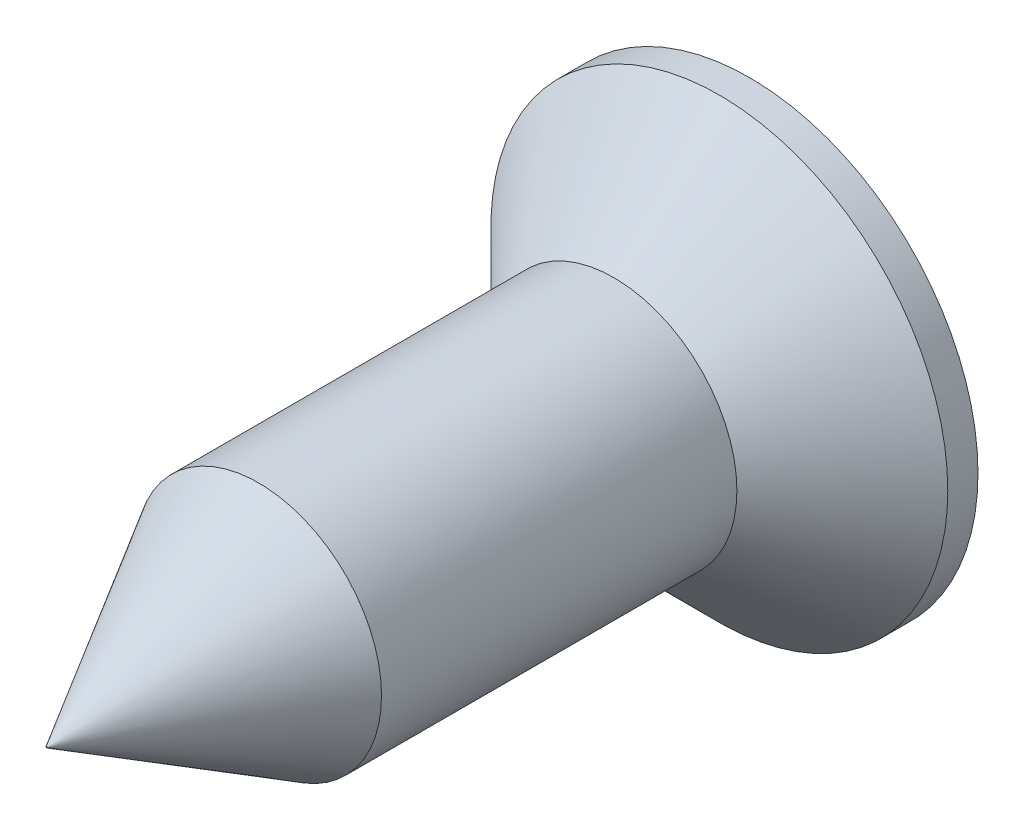
ISO-10303-21;
HEADER;
FILE_DESCRIPTION(('STEP AP214'),'2;1');
FILE_NAME('part.step','',(''),(''),'','','');
FILE_SCHEMA(('AUTOMOTIVE_DESIGN { 1 0 10303 214 1 1 1 1 }'));
ENDSEC;
DATA;
#1=APPLICATION_CONTEXT('core data for automotive mechanical design processes');
#2=APPLICATION_PROTOCOL_DEFINITION('international standard','automotive_design',2000,#1);
#3=PRODUCT_CONTEXT('',#1,'mechanical');
#4=PRODUCT('Part','Part','',(#3));
#5=PRODUCT_RELATED_PRODUCT_CATEGORY('part','',(#4));
#6=PRODUCT_DEFINITION_FORMATION('','',#4);
#7=PRODUCT_DEFINITION_CONTEXT('part definition',#1,'design');
#8=PRODUCT_DEFINITION('design','',#6,#7);
#9=PRODUCT_DEFINITION_SHAPE('','',#8);
#10=(LENGTH_UNIT() NAMED_UNIT(*) SI_UNIT(.MILLI.,.METRE.));
#11=(NAMED_UNIT(*) PLANE_ANGLE_UNIT() SI_UNIT($,.RADIAN.));
#12=(NAMED_UNIT(*) SI_UNIT($,.STERADIAN.) SOLID_ANGLE_UNIT());
#13=UNCERTAINTY_MEASURE_WITH_UNIT(LENGTH_MEASURE(1.E-05),#10,'distance_accuracy_value','');
#14=(GEOMETRIC_REPRESENTATION_CONTEXT(3) GLOBAL_UNCERTAINTY_ASSIGNED_CONTEXT((#13)) GLOBAL_UNIT_ASSIGNED_CONTEXT((#10,
#11,#12)) REPRESENTATION_CONTEXT('',''));
#15=CARTESIAN_POINT('',(0.,0.,0.));
#16=DIRECTION('',(0.,0.,1.));
#17=DIRECTION('',(1.,0.,0.));
#18=AXIS2_PLACEMENT_3D('',#15,#16,#17);
#19=CARTESIAN_POINT('',(3.25,0.,0.));
#20=DIRECTION('',(0.,0.,-1.));
#21=DIRECTION('',(-1.,0.,0.));
#22=AXIS2_PLACEMENT_3D('',#19,#20,#21);
#23=PLANE('',#22);
#24=DIRECTION('',(-1.,0.,0.));
#25=VECTOR('',#24,1.);
#26=CARTESIAN_POINT('',(3.25,2.58289897474369,0.));
#27=LINE('',#26,#25);
#28=CARTESIAN_POINT('',(-0.35,2.58289897474369,0.));
#29=VERTEX_POINT('',#28);
#30=CARTESIAN_POINT('',(0.349999999999998,2.58289897474369,0.));
#31=VERTEX_POINT('',#30);
#32=EDGE_CURVE('E53',#29,#31,#27,.F.);
#33=ORIENTED_EDGE('',*,*,#32,.F.);
#34=DIRECTION('',(0.,1.,0.));
#35=VECTOR('',#34,1.);
#36=CARTESIAN_POINT('',(-0.35,0.845898974743686,0.));
#37=LINE('',#36,#35);
#38=CARTESIAN_POINT('',(-0.35,0.583333333333333,0.));
#39=VERTEX_POINT('',#38);
#40=EDGE_CURVE('E148',#39,#29,#37,.T.);
#41=ORIENTED_EDGE('',*,*,#40,.F.);
#42=CARTESIAN_POINT('',(-0.583333333333333,0.583333333333333,0.));
#43=DIRECTION('',(0.,0.,1.));
#44=DIRECTION('',(1.,0.,0.));
#45=AXIS2_PLACEMENT_3D('',#42,#43,#44);
#46=CIRCLE('',#45,0.233333333333333);
#47=CARTESIAN_POINT('',(-0.583333333333333,0.35,0.));
#48=VERTEX_POINT('',#47);
#49=EDGE_CURVE('E145',#48,#39,#46,.T.);
#50=ORIENTED_EDGE('',*,*,#49,.F.);
#51=DIRECTION('',(1.,0.,0.));
#52=VECTOR('',#51,1.);
#53=CARTESIAN_POINT('',(-0.583333333333333,0.35,0.));
#54=LINE('',#53,#52);
#55=CARTESIAN_POINT('',(-2.58289897474369,0.35,0.));
#56=VERTEX_POINT('',#55);
#57=EDGE_CURVE('E142',#56,#48,#54,.T.);
#58=ORIENTED_EDGE('',*,*,#57,.F.);
#59=DIRECTION('',(0.,-1.,0.));
#60=VECTOR('',#59,1.);
#61=CARTESIAN_POINT('',(-2.58289897474369,0.,0.));
#62=LINE('',#61,#60);
#63=CARTESIAN_POINT('',(-2.58289897474369,-0.35,0.));
#64=VERTEX_POINT('',#63);
#65=EDGE_CURVE('E141',#64,#56,#62,.F.);
#66=ORIENTED_EDGE('',*,*,#65,.F.);
#67=DIRECTION('',(-1.,0.,0.));
#68=VECTOR('',#67,1.);
#69=CARTESIAN_POINT('',(-0.845898974743686,-0.35,0.));
#70=LINE('',#69,#68);
#71=CARTESIAN_POINT('',(-0.583333333333333,-0.35,0.));
#72=VERTEX_POINT('',#71);
#73=EDGE_CURVE('E135',#72,#64,#70,.T.);
#74=ORIENTED_EDGE('',*,*,#73,.F.);
#75=CARTESIAN_POINT('',(-0.583333333333333,-0.583333333333333,0.));
#76=DIRECTION('',(0.,0.,1.));
#77=DIRECTION('',(1.,0.,0.));
#78=AXIS2_PLACEMENT_3D('',#75,#76,#77);
#79=CIRCLE('',#78,0.233333333333333);
#80=CARTESIAN_POINT('',(-0.35,-0.583333333333333,0.));
#81=VERTEX_POINT('',#80);
#82=EDGE_CURVE('E133',#81,#72,#79,.T.);
#83=ORIENTED_EDGE('',*,*,#82,.F.);
#84=DIRECTION('',(0.,1.,0.));
#85=VECTOR('',#84,1.);
#86=CARTESIAN_POINT('',(-0.35,-0.583333333333333,0.));
#87=LINE('',#86,#85);
#88=CARTESIAN_POINT('',(-0.35,-2.58289897474369,0.));
#89=VERTEX_POINT('',#88);
#90=EDGE_CURVE('E111',#89,#81,#87,.T.);
#91=ORIENTED_EDGE('',*,*,#90,.F.);
#92=DIRECTION('',(1.,0.,0.));
#93=VECTOR('',#92,1.);
#94=CARTESIAN_POINT('',(3.25,-2.58289897474369,0.));
#95=LINE('',#94,#93);
#96=CARTESIAN_POINT('',(0.35,-2.58289897474369,0.));
#97=VERTEX_POINT('',#96);
#98=EDGE_CURVE('E123',#97,#89,#95,.F.);
#99=ORIENTED_EDGE('',*,*,#98,.F.);
#100=DIRECTION('',(0.,-1.,0.));
#101=VECTOR('',#100,1.);
#102=CARTESIAN_POINT('',(0.35,-0.845898974743686,0.));
#103=LINE('',#102,#101);
#104=CARTESIAN_POINT('',(0.35,-0.583333333333333,0.));
#105=VERTEX_POINT('',#104);
#106=EDGE_CURVE('E129',#105,#97,#103,.T.);
#107=ORIENTED_EDGE('',*,*,#106,.F.);
#108=CARTESIAN_POINT('',(0.583333333333333,-0.583333333333333,0.));
#109=DIRECTION('',(0.,0.,1.));
#110=DIRECTION('',(1.,0.,0.));
#111=AXIS2_PLACEMENT_3D('',#108,#109,#110);
#112=CIRCLE('',#111,0.233333333333333);
#113=CARTESIAN_POINT('',(0.583333333333333,-0.35,0.));
#114=VERTEX_POINT('',#113);
#115=EDGE_CURVE('E240',#114,#105,#112,.T.);
#116=ORIENTED_EDGE('',*,*,#115,.F.);
#117=DIRECTION('',(-1.,0.,0.));
#118=VECTOR('',#117,1.);
#119=CARTESIAN_POINT('',(0.583333333333333,-0.35,0.));
#120=LINE('',#119,#118);
#121=CARTESIAN_POINT('',(2.58289897474369,-0.35,0.));
#122=VERTEX_POINT('',#121);
#123=EDGE_CURVE('E194',#122,#114,#120,.T.);
#124=ORIENTED_EDGE('',*,*,#123,.F.);
#125=DIRECTION('',(0.,1.,0.));
#126=VECTOR('',#125,1.);
#127=CARTESIAN_POINT('',(2.58289897474369,0.,0.));
#128=LINE('',#127,#126);
#129=CARTESIAN_POINT('',(2.58289897474369,0.35,0.));
#130=VERTEX_POINT('',#129);
#131=EDGE_CURVE('E191',#130,#122,#128,.F.);
#132=ORIENTED_EDGE('',*,*,#131,.F.);
#133=DIRECTION('',(1.,0.,0.));
#134=VECTOR('',#133,1.);
#135=CARTESIAN_POINT('',(0.845898974743686,0.35,0.));
#136=LINE('',#135,#134);
#137=CARTESIAN_POINT('',(0.583333333333333,0.35,0.));
#138=VERTEX_POINT('',#137);
#139=EDGE_CURVE('E195',#138,#130,#136,.T.);
#140=ORIENTED_EDGE('',*,*,#139,.F.);
#141=CARTESIAN_POINT('',(0.583333333333333,0.583333333333333,0.));
#142=DIRECTION('',(0.,0.,1.));
#143=DIRECTION('',(1.,0.,0.));
#144=AXIS2_PLACEMENT_3D('',#141,#142,#143);
#145=CIRCLE('',#144,0.233333333333333);
#146=CARTESIAN_POINT('',(0.35,0.583333333333333,0.));
#147=VERTEX_POINT('',#146);
#148=EDGE_CURVE('E249',#147,#138,#145,.T.);
#149=ORIENTED_EDGE('',*,*,#148,.F.);
#150=DIRECTION('',(0.,-1.,0.));
#151=VECTOR('',#150,1.);
#152=CARTESIAN_POINT('',(0.35,0.583333333333333,0.));
#153=LINE('',#152,#151);
#154=EDGE_CURVE('E187',#31,#147,#153,.T.);
#155=ORIENTED_EDGE('',*,*,#154,.F.);
#156=EDGE_LOOP('',(#33,#41,#50,#58,#66,#74,#83,#91,#99,#107,#116,#124,#132,#140,#149,#155));
#157=FACE_BOUND('',#156,.T.);
#158=CARTESIAN_POINT('',(0.,0.,0.));
#159=DIRECTION('',(0.,0.,1.));
#160=DIRECTION('',(1.,0.,0.));
#161=AXIS2_PLACEMENT_3D('',#158,#159,#160);
#162=CIRCLE('',#161,3.25);
#163=CARTESIAN_POINT('',(3.25,0.,0.));
#164=VERTEX_POINT('',#163);
#165=EDGE_CURVE('E11',#164,#164,#162,.T.);
#166=ORIENTED_EDGE('',*,*,#165,.F.);
#167=EDGE_LOOP('',(#166));
#168=FACE_BOUND('',#167,.T.);
#169=ADVANCED_FACE('F34',(#157,#168),#23,.T.);
#170=CARTESIAN_POINT('',(0.,0.,0.));
#171=DIRECTION('',(0.,0.,1.));
#172=DIRECTION('',(1.,0.,0.));
#173=AXIS2_PLACEMENT_3D('',#170,#171,#172);
#174=CYLINDRICAL_SURFACE('',#173,3.25);
#175=ORIENTED_EDGE('',*,*,#165,.T.);
#176=EDGE_LOOP('',(#175));
#177=FACE_BOUND('',#176,.T.);
#178=CARTESIAN_POINT('',(0.,0.,0.430000000000016));
#179=DIRECTION('',(0.,0.,1.));
#180=DIRECTION('',(1.,0.,0.));
#181=AXIS2_PLACEMENT_3D('',#178,#179,#180);
#182=CIRCLE('',#181,3.25);
#183=CARTESIAN_POINT('',(3.25,0.,0.430000000000016));
#184=VERTEX_POINT('',#183);
#185=EDGE_CURVE('E44',#184,#184,#182,.T.);
#186=ORIENTED_EDGE('',*,*,#185,.F.);
#187=EDGE_LOOP('',(#186));
#188=FACE_BOUND('',#187,.T.);
#189=ADVANCED_FACE('F338',(#177,#188),#174,.T.);
#190=CARTESIAN_POINT('',(0.,0.,1.93));
#191=DIRECTION('',(0.,0.,-1.));
#192=DIRECTION('',(-1.,0.,0.));
#193=AXIS2_PLACEMENT_3D('',#190,#191,#192);
#194=CONICAL_SURFACE('',#193,1.75,0.785398163397453);
#195=ORIENTED_EDGE('',*,*,#185,.T.);
#196=EDGE_LOOP('',(#195));
#197=FACE_BOUND('',#196,.T.);
#198=CARTESIAN_POINT('',(0.,0.,1.93));
#199=DIRECTION('',(0.,0.,1.));
#200=DIRECTION('',(1.,0.,0.));
#201=AXIS2_PLACEMENT_3D('',#198,#199,#200);
#202=CIRCLE('',#201,1.75);
#203=CARTESIAN_POINT('',(1.75,0.,1.93));
#204=VERTEX_POINT('',#203);
#205=EDGE_CURVE('E180',#204,#204,#202,.T.);
#206=ORIENTED_EDGE('',*,*,#205,.F.);
#207=EDGE_LOOP('',(#206));
#208=FACE_BOUND('',#207,.T.);
#209=ADVANCED_FACE('F343',(#197,#208),#194,.T.);
#210=CARTESIAN_POINT('',(0.,0.,0.));
#211=DIRECTION('',(0.,0.,1.));
#212=DIRECTION('',(1.,0.,0.));
#213=AXIS2_PLACEMENT_3D('',#210,#211,#212);
#214=CYLINDRICAL_SURFACE('',#213,1.75);
#215=ORIENTED_EDGE('',*,*,#205,.T.);
#216=EDGE_LOOP('',(#215));
#217=FACE_BOUND('',#216,.T.);
#218=CARTESIAN_POINT('',(0.,0.,6.98623159483011));
#219=DIRECTION('',(0.,0.,1.));
#220=DIRECTION('',(1.,0.,0.));
#221=AXIS2_PLACEMENT_3D('',#218,#219,#220);
#222=CIRCLE('',#221,1.75);
#223=CARTESIAN_POINT('',(-1.75,0.,6.98623159483011));
#224=VERTEX_POINT('',#223);
#225=EDGE_CURVE('E177',#224,#224,#222,.T.);
#226=ORIENTED_EDGE('',*,*,#225,.F.);
#227=EDGE_LOOP('',(#226));
#228=FACE_BOUND('',#227,.T.);
#229=ADVANCED_FACE('F385',(#217,#228),#214,.T.);
#230=CARTESIAN_POINT('',(0.,0.,10.));
#231=DIRECTION('',(0.,0.,-1.));
#232=DIRECTION('',(-1.,0.,0.));
#233=AXIS2_PLACEMENT_3D('',#230,#231,#232);
#234=CONICAL_SURFACE('',#233,0.0100000000000012,0.523598775598293);
#235=CARTESIAN_POINT('',(0.,0.,10.));
#236=DIRECTION('',(0.,0.,1.));
#237=DIRECTION('',(1.,0.,0.));
#238=AXIS2_PLACEMENT_3D('',#235,#236,#237);
#239=CIRCLE('',#238,0.0100000000000012);
#240=CARTESIAN_POINT('',(-0.0100000000000017,0.,10.));
#241=VERTEX_POINT('',#240);
#242=EDGE_CURVE('E174',#241,#241,#239,.T.);
#243=CARTESIAN_POINT('',(-1.75,0.,6.98623159483011));
#244=CARTESIAN_POINT('',(-1.731875,0.,7.0176250157173));
#245=CARTESIAN_POINT('',(-1.71375,0.,7.04901843660449));
#246=CARTESIAN_POINT('',(-1.6775,0.,7.11180527837886));
#247=CARTESIAN_POINT('',(-1.659375,0.,7.14319869926604));
#248=CARTESIAN_POINT('',(-1.623125,0.,7.20598554104042));
#249=CARTESIAN_POINT('',(-1.605,0.,7.2373789619276));
#250=CARTESIAN_POINT('',(-1.56875,0.,7.30016580370198));
#251=CARTESIAN_POINT('',(-1.550625,0.,7.33155922458916));
#252=CARTESIAN_POINT('',(-1.514375,0.,7.39434606636353));
#253=CARTESIAN_POINT('',(-1.49625,0.,7.42573948725072));
#254=CARTESIAN_POINT('',(-1.46,0.,7.48852632902509));
#255=CARTESIAN_POINT('',(-1.441875,0.,7.51991974991228));
#256=CARTESIAN_POINT('',(-1.405625,0.,7.58270659168665));
#257=CARTESIAN_POINT('',(-1.3875,0.,7.61410001257384));
#258=CARTESIAN_POINT('',(-1.35125,0.,7.67688685434821));
#259=CARTESIAN_POINT('',(-1.333125,0.,7.7082802752354));
#260=CARTESIAN_POINT('',(-1.296875,0.,7.77106711700977));
#261=CARTESIAN_POINT('',(-1.27875,0.,7.80246053789696));
#262=CARTESIAN_POINT('',(-1.2425,0.,7.86524737967133));
#263=CARTESIAN_POINT('',(-1.224375,0.,7.89664080055852));
#264=CARTESIAN_POINT('',(-1.188125,0.,7.95942764233289));
#265=CARTESIAN_POINT('',(-1.17,0.,7.99082106322008));
#266=CARTESIAN_POINT('',(-1.13375,0.,8.05360790499445));
#267=CARTESIAN_POINT('',(-1.115625,0.,8.08500132588163));
#268=CARTESIAN_POINT('',(-1.079375,0.,8.147788167656));
#269=CARTESIAN_POINT('',(-1.06125,0.,8.17918158854319));
#270=CARTESIAN_POINT('',(-1.025,0.,8.24196843031756));
#271=CARTESIAN_POINT('',(-1.006875,0.,8.27336185120475));
#272=CARTESIAN_POINT('',(-0.970625000000001,0.,8.33614869297912));
#273=CARTESIAN_POINT('',(-0.952500000000001,0.,8.36754211386631));
#274=CARTESIAN_POINT('',(-0.916250000000001,0.,8.43032895564068));
#275=CARTESIAN_POINT('',(-0.898125000000001,0.,8.46172237652787));
#276=CARTESIAN_POINT('',(-0.861875000000001,0.,8.52450921830224));
#277=CARTESIAN_POINT('',(-0.843750000000001,0.,8.55590263918943));
#278=CARTESIAN_POINT('',(-0.807500000000001,0.,8.6186894809638));
#279=CARTESIAN_POINT('',(-0.789375000000001,0.,8.65008290185099));
#280=CARTESIAN_POINT('',(-0.753125000000001,0.,8.71286974362536));
#281=CARTESIAN_POINT('',(-0.735000000000001,0.,8.74426316451255));
#282=CARTESIAN_POINT('',(-0.698750000000001,0.,8.80705000628692));
#283=CARTESIAN_POINT('',(-0.680625000000001,0.,8.8384434271741));
#284=CARTESIAN_POINT('',(-0.644375000000001,0.,8.90123026894848));
#285=CARTESIAN_POINT('',(-0.626250000000001,0.,8.93262368983567));
#286=CARTESIAN_POINT('',(-0.590000000000001,0.,8.99541053161004));
#287=CARTESIAN_POINT('',(-0.571875000000001,0.,9.02680395249722));
#288=CARTESIAN_POINT('',(-0.535625000000001,0.,9.0895907942716));
#289=CARTESIAN_POINT('',(-0.517500000000001,0.,9.12098421515878));
#290=CARTESIAN_POINT('',(-0.481250000000001,0.,9.18377105693316));
#291=CARTESIAN_POINT('',(-0.463125000000001,0.,9.21516447782034));
#292=CARTESIAN_POINT('',(-0.426875000000002,0.,9.27795131959471));
#293=CARTESIAN_POINT('',(-0.408750000000002,0.,9.3093447404819));
#294=CARTESIAN_POINT('',(-0.372500000000001,0.,9.37213158225627));
#295=CARTESIAN_POINT('',(-0.354375000000001,0.,9.40352500314346));
#296=CARTESIAN_POINT('',(-0.318125000000002,0.,9.46631184491783));
#297=CARTESIAN_POINT('',(-0.300000000000002,0.,9.49770526580502));
#298=CARTESIAN_POINT('',(-0.263750000000002,0.,9.56049210757939));
#299=CARTESIAN_POINT('',(-0.245625000000001,0.,9.59188552846658));
#300=CARTESIAN_POINT('',(-0.209375000000002,0.,9.65467237024095));
#301=CARTESIAN_POINT('',(-0.191250000000002,0.,9.68606579112814));
#302=CARTESIAN_POINT('',(-0.155000000000002,0.,9.74885263290251));
#303=CARTESIAN_POINT('',(-0.136875000000002,0.,9.7802460537897));
#304=CARTESIAN_POINT('',(-0.100625000000001,0.,9.84303289556407));
#305=CARTESIAN_POINT('',(-0.0825000000000015,0.,9.87442631645125));
#306=CARTESIAN_POINT('',(-0.0462500000000017,0.,9.93721315822563));
#307=CARTESIAN_POINT('',(-0.0281250000000018,0.,9.96860657911281));
#308=CARTESIAN_POINT('',(-0.0100000000000017,0.,10.));
#309=B_SPLINE_CURVE_WITH_KNOTS('',3,(#243,#244,#245,#246,#247,#248,#249,#250,#251,#252,#253,
#254,#255,#256,#257,#258,#259,#260,#261,#262,#263,#264,#265,#266,#267,#268,#269,#270,#271,#272,
#273,#274,#275,#276,#277,#278,#279,#280,#281,#282,#283,#284,#285,#286,#287,#288,#289,#290,#291,
#292,#293,#294,#295,#296,#297,#298,#299,#300,#301,#302,#303,#304,#305,#306,#307,#308),
.UNSPECIFIED.,.F.,.F.,(4,2,2,2,2,2,2,2,2,2,2,2,2,2,2,2,2,2,2,2,2,2,2,2,2,2,2,2,2,2,2,2,4),(0.,
0.108750000000001,0.217500000000002,0.326250000000003,0.435000000000005,0.543750000000005,
0.652500000000007,0.761250000000008,0.870000000000009,0.978750000000009,1.08750000000001,
1.19625000000001,1.30500000000001,1.41375000000001,1.52250000000002,1.63125000000002,
1.74000000000002,1.84875000000002,1.95750000000002,2.06625000000002,2.17500000000002,
2.28375000000002,2.39250000000002,2.50125000000003,2.61000000000003,2.71875000000003,
2.82750000000003,2.93625000000003,3.04500000000003,3.15375000000003,3.26250000000003,
3.37125000000003,3.48000000000004),.UNSPECIFIED.);
#310=EDGE_CURVE('BSEAM381',#224,#241,#309,.T.);
#311=ORIENTED_EDGE('',*,*,#225,.T.);
#312=ORIENTED_EDGE('',*,*,#242,.F.);
#313=ORIENTED_EDGE('',*,*,#310,.T.);
#314=ORIENTED_EDGE('',*,*,#310,.F.);
#315=EDGE_LOOP('',(#311,#313,#312,#314));
#316=FACE_BOUND('',#315,.T.);
#317=ADVANCED_FACE('F381',(#316),#234,.T.);
#318=CARTESIAN_POINT('',(0.,0.,10.));
#319=DIRECTION('',(0.,0.,1.));
#320=DIRECTION('',(1.,0.,0.));
#321=AXIS2_PLACEMENT_3D('',#318,#319,#320);
#322=PLANE('',#321);
#323=ORIENTED_EDGE('',*,*,#242,.T.);
#324=EDGE_LOOP('',(#323));
#325=FACE_BOUND('',#324,.T.);
#326=ADVANCED_FACE('F378',(#325),#322,.T.);
#327=CARTESIAN_POINT('',(0.35,0.845898974743686,1.737));
#328=DIRECTION('',(0.,-0.707106781186546,-0.707106781186549));
#329=DIRECTION('',(0.,0.707106781186549,-0.707106781186546));
#330=AXIS2_PLACEMENT_3D('',#327,#328,#329);
#331=PLANE('',#330);
#332=ORIENTED_EDGE('',*,*,#32,.T.);
#333=DIRECTION('',(0.,-0.707106781186549,0.707106781186546));
#334=VECTOR('',#333,1.);
#335=CARTESIAN_POINT('',(0.35,0.845898974743686,1.737));
#336=LINE('',#335,#334);
#337=CARTESIAN_POINT('',(0.35,0.845898974743686,1.737));
#338=VERTEX_POINT('',#337);
#339=EDGE_CURVE('E173',#338,#31,#336,.F.);
#340=ORIENTED_EDGE('',*,*,#339,.F.);
#341=DIRECTION('',(1.,0.,0.));
#342=VECTOR('',#341,1.);
#343=CARTESIAN_POINT('',(0.35,0.845898974743686,1.737));
#344=LINE('',#343,#342);
#345=CARTESIAN_POINT('',(-0.35,0.845898974743686,1.737));
#346=VERTEX_POINT('',#345);
#347=EDGE_CURVE('E151',#346,#338,#344,.T.);
#348=ORIENTED_EDGE('',*,*,#347,.F.);
#349=DIRECTION('',(0.,-0.707106781186549,0.707106781186546));
#350=VECTOR('',#349,1.);
#351=CARTESIAN_POINT('',(-0.35,0.845898974743686,1.737));
#352=LINE('',#351,#350);
#353=EDGE_CURVE('E154',#346,#29,#352,.F.);
#354=ORIENTED_EDGE('',*,*,#353,.T.);
#355=EDGE_LOOP('',(#332,#340,#348,#354));
#356=FACE_BOUND('',#355,.T.);
#357=ADVANCED_FACE('F36',(#356),#331,.T.);
#358=CARTESIAN_POINT('',(-0.35,0.845898974743686,1.737));
#359=DIRECTION('',(-1.,0.,0.));
#360=DIRECTION('',(0.,0.,1.));
#361=AXIS2_PLACEMENT_3D('',#358,#359,#360);
#362=PLANE('',#361);
#363=ORIENTED_EDGE('',*,*,#40,.T.);
#364=ORIENTED_EDGE('',*,*,#353,.F.);
#365=DIRECTION('',(0.,1.,0.));
#366=VECTOR('',#365,1.);
#367=CARTESIAN_POINT('',(-0.35,0.845898974743686,1.737));
#368=LINE('',#367,#366);
#369=CARTESIAN_POINT('',(-0.35,0.583333333333333,1.737));
#370=VERTEX_POINT('',#369);
#371=EDGE_CURVE('E190',#370,#346,#368,.T.);
#372=ORIENTED_EDGE('',*,*,#371,.F.);
#373=DIRECTION('',(0.,0.,-1.));
#374=VECTOR('',#373,1.);
#375=CARTESIAN_POINT('',(-0.35,0.583333333333333,1.737));
#376=LINE('',#375,#374);
#377=EDGE_CURVE('E152',#370,#39,#376,.T.);
#378=ORIENTED_EDGE('',*,*,#377,.T.);
#379=EDGE_LOOP('',(#363,#364,#372,#378));
#380=FACE_BOUND('',#379,.T.);
#381=ADVANCED_FACE('F421',(#380),#362,.F.);
#382=CARTESIAN_POINT('',(-0.583333333333333,0.583333333333333,1.737));
#383=DIRECTION('',(0.,0.,-1.));
#384=DIRECTION('',(-1.,0.,0.));
#385=AXIS2_PLACEMENT_3D('',#382,#383,#384);
#386=CYLINDRICAL_SURFACE('',#385,0.233333333333333);
#387=ORIENTED_EDGE('',*,*,#49,.T.);
#388=ORIENTED_EDGE('',*,*,#377,.F.);
#389=CARTESIAN_POINT('',(-0.583333333333333,0.583333333333333,1.737));
#390=DIRECTION('',(0.,0.,1.));
#391=DIRECTION('',(1.,0.,0.));
#392=AXIS2_PLACEMENT_3D('',#389,#390,#391);
#393=CIRCLE('',#392,0.233333333333333);
#394=CARTESIAN_POINT('',(-0.583333333333333,0.35,1.737));
#395=VERTEX_POINT('',#394);
#396=EDGE_CURVE('E218',#395,#370,#393,.T.);
#397=ORIENTED_EDGE('',*,*,#396,.F.);
#398=DIRECTION('',(0.,0.,-1.));
#399=VECTOR('',#398,1.);
#400=CARTESIAN_POINT('',(-0.583333333333333,0.35,1.737));
#401=LINE('',#400,#399);
#402=EDGE_CURVE('E155',#395,#48,#401,.T.);
#403=ORIENTED_EDGE('',*,*,#402,.T.);
#404=EDGE_LOOP('',(#387,#388,#397,#403));
#405=FACE_BOUND('',#404,.T.);
#406=ADVANCED_FACE('F214',(#405),#386,.T.);
#407=CARTESIAN_POINT('',(-0.583333333333333,0.35,1.737));
#408=DIRECTION('',(0.,1.,0.));
#409=DIRECTION('',(0.,0.,1.));
#410=AXIS2_PLACEMENT_3D('',#407,#408,#409);
#411=PLANE('',#410);
#412=ORIENTED_EDGE('',*,*,#57,.T.);
#413=ORIENTED_EDGE('',*,*,#402,.F.);
#414=DIRECTION('',(1.,0.,0.));
#415=VECTOR('',#414,1.);
#416=CARTESIAN_POINT('',(-0.583333333333333,0.35,1.737));
#417=LINE('',#416,#415);
#418=CARTESIAN_POINT('',(-0.845898974743686,0.35,1.737));
#419=VERTEX_POINT('',#418);
#420=EDGE_CURVE('E207',#419,#395,#417,.T.);
#421=ORIENTED_EDGE('',*,*,#420,.F.);
#422=DIRECTION('',(0.707106781186549,0.,0.707106781186546));
#423=VECTOR('',#422,1.);
#424=CARTESIAN_POINT('',(-0.845898974743686,0.35,1.737));
#425=LINE('',#424,#423);
#426=EDGE_CURVE('E38',#419,#56,#425,.F.);
#427=ORIENTED_EDGE('',*,*,#426,.T.);
#428=EDGE_LOOP('',(#412,#413,#421,#427));
#429=FACE_BOUND('',#428,.T.);
#430=ADVANCED_FACE('F201',(#429),#411,.F.);
#431=CARTESIAN_POINT('',(-0.845898974743686,0.35,1.737));
#432=DIRECTION('',(0.707106781186546,0.,-0.707106781186549));
#433=DIRECTION('',(-0.707106781186549,0.,-0.707106781186546));
#434=AXIS2_PLACEMENT_3D('',#431,#432,#433);
#435=PLANE('',#434);
#436=ORIENTED_EDGE('',*,*,#65,.T.);
#437=ORIENTED_EDGE('',*,*,#426,.F.);
#438=DIRECTION('',(0.,1.,0.));
#439=VECTOR('',#438,1.);
#440=CARTESIAN_POINT('',(-0.845898974743686,0.35,1.737));
#441=LINE('',#440,#439);
#442=CARTESIAN_POINT('',(-0.845898974743686,-0.35,1.737));
#443=VERTEX_POINT('',#442);
#444=EDGE_CURVE('E258',#443,#419,#441,.T.);
#445=ORIENTED_EDGE('',*,*,#444,.F.);
#446=DIRECTION('',(0.707106781186549,0.,0.707106781186546));
#447=VECTOR('',#446,1.);
#448=CARTESIAN_POINT('',(-0.845898974743686,-0.35,1.737));
#449=LINE('',#448,#447);
#450=EDGE_CURVE('E76',#443,#64,#449,.F.);
#451=ORIENTED_EDGE('',*,*,#450,.T.);
#452=EDGE_LOOP('',(#436,#437,#445,#451));
#453=FACE_BOUND('',#452,.T.);
#454=ADVANCED_FACE('F210',(#453),#435,.T.);
#455=CARTESIAN_POINT('',(-0.845898974743686,-0.35,1.737));
#456=DIRECTION('',(0.,-1.,0.));
#457=DIRECTION('',(0.,0.,-1.));
#458=AXIS2_PLACEMENT_3D('',#455,#456,#457);
#459=PLANE('',#458);
#460=ORIENTED_EDGE('',*,*,#73,.T.);
#461=ORIENTED_EDGE('',*,*,#450,.F.);
#462=DIRECTION('',(-1.,0.,0.));
#463=VECTOR('',#462,1.);
#464=CARTESIAN_POINT('',(-0.845898974743686,-0.35,1.737));
#465=LINE('',#464,#463);
#466=CARTESIAN_POINT('',(-0.583333333333333,-0.35,1.737));
#467=VERTEX_POINT('',#466);
#468=EDGE_CURVE('E260',#467,#443,#465,.T.);
#469=ORIENTED_EDGE('',*,*,#468,.F.);
#470=DIRECTION('',(0.,0.,-1.));
#471=VECTOR('',#470,1.);
#472=CARTESIAN_POINT('',(-0.583333333333333,-0.35,1.737));
#473=LINE('',#472,#471);
#474=EDGE_CURVE('E86',#467,#72,#473,.T.);
#475=ORIENTED_EDGE('',*,*,#474,.T.);
#476=EDGE_LOOP('',(#460,#461,#469,#475));
#477=FACE_BOUND('',#476,.T.);
#478=ADVANCED_FACE('F325',(#477),#459,.F.);
#479=CARTESIAN_POINT('',(-0.583333333333333,-0.583333333333333,1.737));
#480=DIRECTION('',(0.,0.,-1.));
#481=DIRECTION('',(-1.,0.,0.));
#482=AXIS2_PLACEMENT_3D('',#479,#480,#481);
#483=CYLINDRICAL_SURFACE('',#482,0.233333333333333);
#484=ORIENTED_EDGE('',*,*,#82,.T.);
#485=ORIENTED_EDGE('',*,*,#474,.F.);
#486=CARTESIAN_POINT('',(-0.583333333333333,-0.583333333333333,1.737));
#487=DIRECTION('',(0.,0.,1.));
#488=DIRECTION('',(1.,0.,0.));
#489=AXIS2_PLACEMENT_3D('',#486,#487,#488);
#490=CIRCLE('',#489,0.233333333333333);
#491=CARTESIAN_POINT('',(-0.35,-0.583333333333333,1.737));
#492=VERTEX_POINT('',#491);
#493=EDGE_CURVE('E263',#492,#467,#490,.T.);
#494=ORIENTED_EDGE('',*,*,#493,.F.);
#495=DIRECTION('',(0.,0.,-1.));
#496=VECTOR('',#495,1.);
#497=CARTESIAN_POINT('',(-0.35,-0.583333333333333,1.737));
#498=LINE('',#497,#496);
#499=EDGE_CURVE('E119',#492,#81,#498,.T.);
#500=ORIENTED_EDGE('',*,*,#499,.T.);
#501=EDGE_LOOP('',(#484,#485,#494,#500));
#502=FACE_BOUND('',#501,.T.);
#503=ADVANCED_FACE('F328',(#502),#483,.T.);
#504=CARTESIAN_POINT('',(-0.35,-0.583333333333333,1.737));
#505=DIRECTION('',(-1.,0.,0.));
#506=DIRECTION('',(0.,-1.,0.));
#507=AXIS2_PLACEMENT_3D('',#504,#505,#506);
#508=PLANE('',#507);
#509=ORIENTED_EDGE('',*,*,#90,.T.);
#510=ORIENTED_EDGE('',*,*,#499,.F.);
#511=DIRECTION('',(0.,1.,0.));
#512=VECTOR('',#511,1.);
#513=CARTESIAN_POINT('',(-0.35,-0.583333333333333,1.737));
#514=LINE('',#513,#512);
#515=CARTESIAN_POINT('',(-0.35,-0.845898974743686,1.737));
#516=VERTEX_POINT('',#515);
#517=EDGE_CURVE('E115',#516,#492,#514,.T.);
#518=ORIENTED_EDGE('',*,*,#517,.F.);
#519=DIRECTION('',(0.,0.707106781186549,0.707106781186546));
#520=VECTOR('',#519,1.);
#521=CARTESIAN_POINT('',(-0.35,-0.845898974743686,1.737));
#522=LINE('',#521,#520);
#523=EDGE_CURVE('E106',#516,#89,#522,.F.);
#524=ORIENTED_EDGE('',*,*,#523,.T.);
#525=EDGE_LOOP('',(#509,#510,#518,#524));
#526=FACE_BOUND('',#525,.T.);
#527=ADVANCED_FACE('F108',(#526),#508,.F.);
#528=CARTESIAN_POINT('',(-0.35,-0.845898974743686,1.737));
#529=DIRECTION('',(0.,0.707106781186546,-0.707106781186549));
#530=DIRECTION('',(0.,0.707106781186549,0.707106781186546));
#531=AXIS2_PLACEMENT_3D('',#528,#529,#530);
#532=PLANE('',#531);
#533=ORIENTED_EDGE('',*,*,#98,.T.);
#534=ORIENTED_EDGE('',*,*,#523,.F.);
#535=DIRECTION('',(-1.,0.,0.));
#536=VECTOR('',#535,1.);
#537=CARTESIAN_POINT('',(-0.35,-0.845898974743686,1.737));
#538=LINE('',#537,#536);
#539=CARTESIAN_POINT('',(0.35,-0.845898974743686,1.737));
#540=VERTEX_POINT('',#539);
#541=EDGE_CURVE('E267',#540,#516,#538,.T.);
#542=ORIENTED_EDGE('',*,*,#541,.F.);
#543=DIRECTION('',(0.,0.707106781186549,0.707106781186546));
#544=VECTOR('',#543,1.);
#545=CARTESIAN_POINT('',(0.35,-0.845898974743686,1.737));
#546=LINE('',#545,#544);
#547=EDGE_CURVE('E120',#540,#97,#546,.F.);
#548=ORIENTED_EDGE('',*,*,#547,.T.);
#549=EDGE_LOOP('',(#533,#534,#542,#548));
#550=FACE_BOUND('',#549,.T.);
#551=ADVANCED_FACE('F124',(#550),#532,.T.);
#552=CARTESIAN_POINT('',(0.35,-0.845898974743686,1.737));
#553=DIRECTION('',(1.,0.,0.));
#554=DIRECTION('',(0.,0.,-1.));
#555=AXIS2_PLACEMENT_3D('',#552,#553,#554);
#556=PLANE('',#555);
#557=ORIENTED_EDGE('',*,*,#106,.T.);
#558=ORIENTED_EDGE('',*,*,#547,.F.);
#559=DIRECTION('',(0.,-1.,0.));
#560=VECTOR('',#559,1.);
#561=CARTESIAN_POINT('',(0.35,-0.845898974743686,1.737));
#562=LINE('',#561,#560);
#563=CARTESIAN_POINT('',(0.35,-0.583333333333333,1.737));
#564=VERTEX_POINT('',#563);
#565=EDGE_CURVE('E235',#564,#540,#562,.T.);
#566=ORIENTED_EDGE('',*,*,#565,.F.);
#567=DIRECTION('',(0.,0.,-1.));
#568=VECTOR('',#567,1.);
#569=CARTESIAN_POINT('',(0.35,-0.583333333333333,1.737));
#570=LINE('',#569,#568);
#571=EDGE_CURVE('E159',#564,#105,#570,.T.);
#572=ORIENTED_EDGE('',*,*,#571,.T.);
#573=EDGE_LOOP('',(#557,#558,#566,#572));
#574=FACE_BOUND('',#573,.T.);
#575=ADVANCED_FACE('F232',(#574),#556,.F.);
#576=CARTESIAN_POINT('',(0.583333333333333,-0.583333333333333,1.737));
#577=DIRECTION('',(0.,0.,-1.));
#578=DIRECTION('',(-1.,0.,0.));
#579=AXIS2_PLACEMENT_3D('',#576,#577,#578);
#580=CYLINDRICAL_SURFACE('',#579,0.233333333333333);
#581=ORIENTED_EDGE('',*,*,#115,.T.);
#582=ORIENTED_EDGE('',*,*,#571,.F.);
#583=CARTESIAN_POINT('',(0.583333333333333,-0.583333333333333,1.737));
#584=DIRECTION('',(0.,0.,1.));
#585=DIRECTION('',(1.,0.,0.));
#586=AXIS2_PLACEMENT_3D('',#583,#584,#585);
#587=CIRCLE('',#586,0.233333333333333);
#588=CARTESIAN_POINT('',(0.583333333333333,-0.35,1.737));
#589=VERTEX_POINT('',#588);
#590=EDGE_CURVE('E270',#589,#564,#587,.T.);
#591=ORIENTED_EDGE('',*,*,#590,.F.);
#592=DIRECTION('',(0.,0.,-1.));
#593=VECTOR('',#592,1.);
#594=CARTESIAN_POINT('',(0.583333333333333,-0.35,1.737));
#595=LINE('',#594,#593);
#596=EDGE_CURVE('E162',#589,#114,#595,.T.);
#597=ORIENTED_EDGE('',*,*,#596,.T.);
#598=EDGE_LOOP('',(#581,#582,#591,#597));
#599=FACE_BOUND('',#598,.T.);
#600=ADVANCED_FACE('F241',(#599),#580,.T.);
#601=CARTESIAN_POINT('',(0.583333333333333,-0.35,1.737));
#602=DIRECTION('',(0.,-1.,0.));
#603=DIRECTION('',(1.,0.,0.));
#604=AXIS2_PLACEMENT_3D('',#601,#602,#603);
#605=PLANE('',#604);
#606=ORIENTED_EDGE('',*,*,#123,.T.);
#607=ORIENTED_EDGE('',*,*,#596,.F.);
#608=DIRECTION('',(-1.,0.,0.));
#609=VECTOR('',#608,1.);
#610=CARTESIAN_POINT('',(0.583333333333333,-0.35,1.737));
#611=LINE('',#610,#609);
#612=CARTESIAN_POINT('',(0.845898974743686,-0.35,1.737));
#613=VERTEX_POINT('',#612);
#614=EDGE_CURVE('E272',#613,#589,#611,.T.);
#615=ORIENTED_EDGE('',*,*,#614,.F.);
#616=DIRECTION('',(-0.707106781186549,0.,0.707106781186546));
#617=VECTOR('',#616,1.);
#618=CARTESIAN_POINT('',(0.845898974743686,-0.35,1.737));
#619=LINE('',#618,#617);
#620=EDGE_CURVE('E165',#613,#122,#619,.F.);
#621=ORIENTED_EDGE('',*,*,#620,.T.);
#622=EDGE_LOOP('',(#606,#607,#615,#621));
#623=FACE_BOUND('',#622,.T.);
#624=ADVANCED_FACE('F354',(#623),#605,.F.);
#625=CARTESIAN_POINT('',(0.845898974743686,-0.35,1.737));
#626=DIRECTION('',(-0.707106781186546,0.,-0.707106781186549));
#627=DIRECTION('',(-0.707106781186549,0.,0.707106781186546));
#628=AXIS2_PLACEMENT_3D('',#625,#626,#627);
#629=PLANE('',#628);
#630=ORIENTED_EDGE('',*,*,#131,.T.);
#631=ORIENTED_EDGE('',*,*,#620,.F.);
#632=DIRECTION('',(0.,-1.,0.));
#633=VECTOR('',#632,1.);
#634=CARTESIAN_POINT('',(0.845898974743686,-0.35,1.737));
#635=LINE('',#634,#633);
#636=CARTESIAN_POINT('',(0.845898974743686,0.35,1.737));
#637=VERTEX_POINT('',#636);
#638=EDGE_CURVE('E275',#637,#613,#635,.T.);
#639=ORIENTED_EDGE('',*,*,#638,.F.);
#640=DIRECTION('',(-0.707106781186549,0.,0.707106781186546));
#641=VECTOR('',#640,1.);
#642=CARTESIAN_POINT('',(0.845898974743686,0.35,1.737));
#643=LINE('',#642,#641);
#644=EDGE_CURVE('E169',#637,#130,#643,.F.);
#645=ORIENTED_EDGE('',*,*,#644,.T.);
#646=EDGE_LOOP('',(#630,#631,#639,#645));
#647=FACE_BOUND('',#646,.T.);
#648=ADVANCED_FACE('F351',(#647),#629,.T.);
#649=CARTESIAN_POINT('',(0.845898974743686,0.35,1.737));
#650=DIRECTION('',(0.,1.,0.));
#651=DIRECTION('',(0.,0.,1.));
#652=AXIS2_PLACEMENT_3D('',#649,#650,#651);
#653=PLANE('',#652);
#654=ORIENTED_EDGE('',*,*,#139,.T.);
#655=ORIENTED_EDGE('',*,*,#644,.F.);
#656=DIRECTION('',(1.,0.,0.));
#657=VECTOR('',#656,1.);
#658=CARTESIAN_POINT('',(0.845898974743686,0.35,1.737));
#659=LINE('',#658,#657);
#660=CARTESIAN_POINT('',(0.583333333333333,0.35,1.737));
#661=VERTEX_POINT('',#660);
#662=EDGE_CURVE('E278',#661,#637,#659,.T.);
#663=ORIENTED_EDGE('',*,*,#662,.F.);
#664=DIRECTION('',(0.,0.,-1.));
#665=VECTOR('',#664,1.);
#666=CARTESIAN_POINT('',(0.583333333333333,0.35,1.737));
#667=LINE('',#666,#665);
#668=EDGE_CURVE('E166',#661,#138,#667,.T.);
#669=ORIENTED_EDGE('',*,*,#668,.T.);
#670=EDGE_LOOP('',(#654,#655,#663,#669));
#671=FACE_BOUND('',#670,.T.);
#672=ADVANCED_FACE('F353',(#671),#653,.F.);
#673=CARTESIAN_POINT('',(0.583333333333333,0.583333333333333,1.737));
#674=DIRECTION('',(0.,0.,-1.));
#675=DIRECTION('',(-1.,0.,0.));
#676=AXIS2_PLACEMENT_3D('',#673,#674,#675);
#677=CYLINDRICAL_SURFACE('',#676,0.233333333333333);
#678=ORIENTED_EDGE('',*,*,#148,.T.);
#679=ORIENTED_EDGE('',*,*,#668,.F.);
#680=CARTESIAN_POINT('',(0.583333333333333,0.583333333333333,1.737));
#681=DIRECTION('',(0.,0.,1.));
#682=DIRECTION('',(1.,0.,0.));
#683=AXIS2_PLACEMENT_3D('',#680,#681,#682);
#684=CIRCLE('',#683,0.233333333333333);
#685=CARTESIAN_POINT('',(0.35,0.583333333333333,1.737));
#686=VERTEX_POINT('',#685);
#687=EDGE_CURVE('E281',#686,#661,#684,.T.);
#688=ORIENTED_EDGE('',*,*,#687,.F.);
#689=DIRECTION('',(0.,0.,-1.));
#690=VECTOR('',#689,1.);
#691=CARTESIAN_POINT('',(0.35,0.583333333333333,1.737));
#692=LINE('',#691,#690);
#693=EDGE_CURVE('E170',#686,#147,#692,.T.);
#694=ORIENTED_EDGE('',*,*,#693,.T.);
#695=EDGE_LOOP('',(#678,#679,#688,#694));
#696=FACE_BOUND('',#695,.T.);
#697=ADVANCED_FACE('F306',(#696),#677,.T.);
#698=CARTESIAN_POINT('',(0.35,0.583333333333333,1.737));
#699=DIRECTION('',(1.,0.,0.));
#700=DIRECTION('',(0.,1.,0.));
#701=AXIS2_PLACEMENT_3D('',#698,#699,#700);
#702=PLANE('',#701);
#703=ORIENTED_EDGE('',*,*,#154,.T.);
#704=ORIENTED_EDGE('',*,*,#693,.F.);
#705=DIRECTION('',(0.,-1.,0.));
#706=VECTOR('',#705,1.);
#707=CARTESIAN_POINT('',(0.35,0.583333333333333,1.737));
#708=LINE('',#707,#706);
#709=EDGE_CURVE('E284',#338,#686,#708,.T.);
#710=ORIENTED_EDGE('',*,*,#709,.F.);
#711=ORIENTED_EDGE('',*,*,#339,.T.);
#712=EDGE_LOOP('',(#703,#704,#710,#711));
#713=FACE_BOUND('',#712,.T.);
#714=ADVANCED_FACE('F299',(#713),#702,.F.);
#715=CARTESIAN_POINT('',(-0.583333333333333,0.583333333333333,1.737));
#716=DIRECTION('',(0.,0.,1.));
#717=DIRECTION('',(1.,0.,0.));
#718=AXIS2_PLACEMENT_3D('',#715,#716,#717);
#719=PLANE('',#718);
#720=ORIENTED_EDGE('',*,*,#347,.T.);
#721=ORIENTED_EDGE('',*,*,#709,.T.);
#722=ORIENTED_EDGE('',*,*,#687,.T.);
#723=ORIENTED_EDGE('',*,*,#662,.T.);
#724=ORIENTED_EDGE('',*,*,#638,.T.);
#725=ORIENTED_EDGE('',*,*,#614,.T.);
#726=ORIENTED_EDGE('',*,*,#590,.T.);
#727=ORIENTED_EDGE('',*,*,#565,.T.);
#728=ORIENTED_EDGE('',*,*,#541,.T.);
#729=ORIENTED_EDGE('',*,*,#517,.T.);
#730=ORIENTED_EDGE('',*,*,#493,.T.);
#731=ORIENTED_EDGE('',*,*,#468,.T.);
#732=ORIENTED_EDGE('',*,*,#444,.T.);
#733=ORIENTED_EDGE('',*,*,#420,.T.);
#734=ORIENTED_EDGE('',*,*,#396,.T.);
#735=ORIENTED_EDGE('',*,*,#371,.T.);
#736=EDGE_LOOP('',(#720,#721,#722,#723,#724,#725,#726,#727,#728,#729,#730,#731,#732,#733,#734,#735));
#737=FACE_BOUND('',#736,.T.);
#738=ADVANCED_FACE('F291',(#737),#719,.F.);
#739=CLOSED_SHELL('',(#169,#189,#209,#229,#317,#326,#357,#381,#406,#430,#454,#478,#503,#527,
#551,#575,#600,#624,#648,#672,#697,#714,#738));
#740=MANIFOLD_SOLID_BREP('B2',#739);
#741=ADVANCED_BREP_SHAPE_REPRESENTATION('',(#18,#740),#14);
#742=SHAPE_DEFINITION_REPRESENTATION(#9,#741);
ENDSEC;
END-ISO-10303-21;
